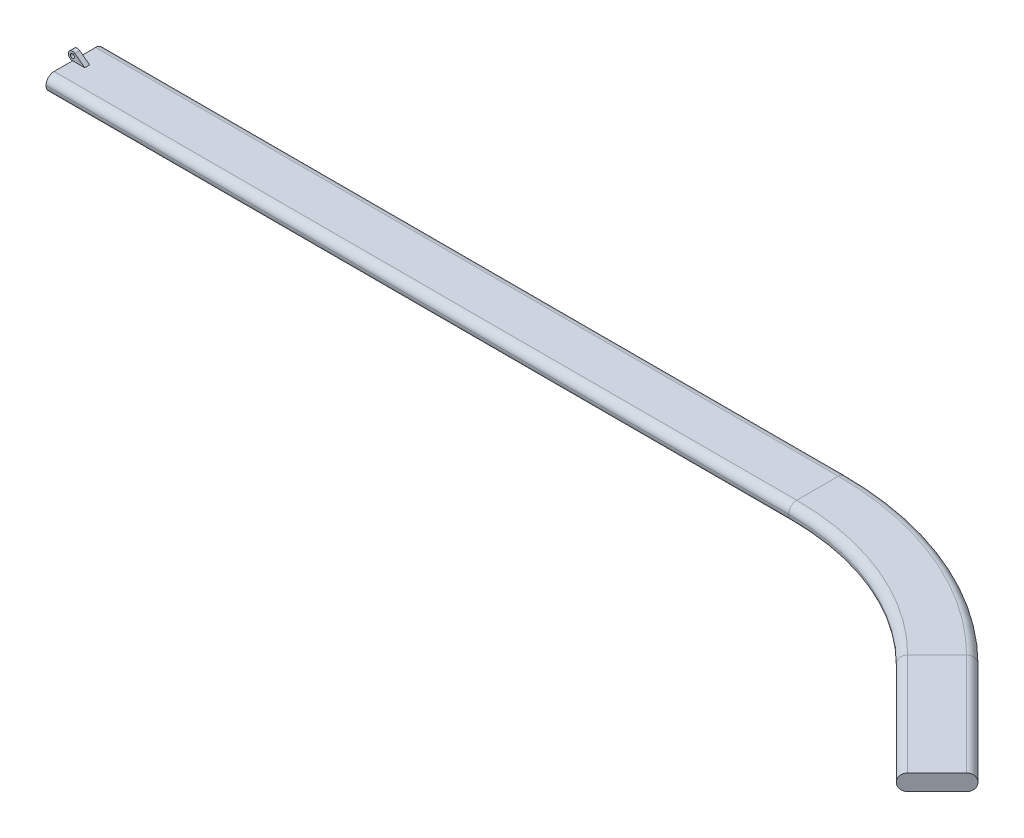
ISO-10303-21;
HEADER;
FILE_DESCRIPTION(('STEP AP214'),'2;1');
FILE_NAME('part.step','',(''),(''),'','','');
FILE_SCHEMA(('AUTOMOTIVE_DESIGN { 1 0 10303 214 1 1 1 1 }'));
ENDSEC;
DATA;
#1=APPLICATION_CONTEXT('core data for automotive mechanical design processes');
#2=APPLICATION_PROTOCOL_DEFINITION('international standard','automotive_design',2000,#1);
#3=PRODUCT_CONTEXT('',#1,'mechanical');
#4=PRODUCT('Part','Part','',(#3));
#5=PRODUCT_RELATED_PRODUCT_CATEGORY('part','',(#4));
#6=PRODUCT_DEFINITION_FORMATION('','',#4);
#7=PRODUCT_DEFINITION_CONTEXT('part definition',#1,'design');
#8=PRODUCT_DEFINITION('design','',#6,#7);
#9=PRODUCT_DEFINITION_SHAPE('','',#8);
#10=(LENGTH_UNIT() NAMED_UNIT(*) SI_UNIT(.MILLI.,.METRE.));
#11=(NAMED_UNIT(*) PLANE_ANGLE_UNIT() SI_UNIT($,.RADIAN.));
#12=(NAMED_UNIT(*) SI_UNIT($,.STERADIAN.) SOLID_ANGLE_UNIT());
#13=UNCERTAINTY_MEASURE_WITH_UNIT(LENGTH_MEASURE(1.E-05),#10,'distance_accuracy_value','');
#14=(GEOMETRIC_REPRESENTATION_CONTEXT(3) GLOBAL_UNCERTAINTY_ASSIGNED_CONTEXT((#13)) GLOBAL_UNIT_ASSIGNED_CONTEXT((#10,
#11,#12)) REPRESENTATION_CONTEXT('',''));
#15=CARTESIAN_POINT('',(0.,0.,0.));
#16=DIRECTION('',(0.,0.,1.));
#17=DIRECTION('',(1.,0.,0.));
#18=AXIS2_PLACEMENT_3D('',#15,#16,#17);
#19=CARTESIAN_POINT('',(0.302042669776638,1.90345981683758,-0.3));
#20=DIRECTION('',(0.604085339553166,0.796919633675151,0.));
#21=DIRECTION('',(-0.796919633675151,0.604085339553166,0.));
#22=AXIS2_PLACEMENT_3D('',#19,#20,#21);
#23=PLANE('',#22);
#24=DIRECTION('',(-0.796919633675151,0.604085339553166,0.));
#25=VECTOR('',#24,1.);
#26=CARTESIAN_POINT('',(0.302042669776638,1.90345981683758,0.3));
#27=LINE('',#26,#25);
#28=CARTESIAN_POINT('',(1.48730611059389,1.005,0.3));
#29=VERTEX_POINT('',#28);
#30=CARTESIAN_POINT('',(0.302042669776638,1.90345981683758,0.3));
#31=VERTEX_POINT('',#30);
#32=EDGE_CURVE('E100',#29,#31,#27,.T.);
#33=ORIENTED_EDGE('',*,*,#32,.F.);
#34=DIRECTION('',(0.,0.,1.));
#35=VECTOR('',#34,1.);
#36=CARTESIAN_POINT('',(1.48730611059389,1.005,-0.3));
#37=LINE('',#36,#35);
#38=CARTESIAN_POINT('',(1.48730611059389,1.005,-0.3));
#39=VERTEX_POINT('',#38);
#40=EDGE_CURVE('E12',#39,#29,#37,.T.);
#41=ORIENTED_EDGE('',*,*,#40,.F.);
#42=DIRECTION('',(-0.796919633675151,0.604085339553166,0.));
#43=VECTOR('',#42,1.);
#44=CARTESIAN_POINT('',(0.302042669776638,1.90345981683758,-0.3));
#45=LINE('',#44,#43);
#46=CARTESIAN_POINT('',(0.302042669776638,1.90345981683758,-0.3));
#47=VERTEX_POINT('',#46);
#48=EDGE_CURVE('E89',#39,#47,#45,.T.);
#49=ORIENTED_EDGE('',*,*,#48,.T.);
#50=DIRECTION('',(0.,0.,1.));
#51=VECTOR('',#50,1.);
#52=CARTESIAN_POINT('',(0.302042669776638,1.90345981683758,-0.3));
#53=LINE('',#52,#51);
#54=EDGE_CURVE('E48',#47,#31,#53,.T.);
#55=ORIENTED_EDGE('',*,*,#54,.T.);
#56=EDGE_LOOP('',(#33,#41,#49,#55));
#57=FACE_BOUND('',#56,.T.);
#58=ADVANCED_FACE('F45',(#57),#23,.T.);
#59=CARTESIAN_POINT('',(1.48730611059389,1.005,-0.3));
#60=DIRECTION('',(0.,-1.,0.));
#61=DIRECTION('',(0.,0.,-1.));
#62=AXIS2_PLACEMENT_3D('',#59,#60,#61);
#63=PLANE('',#62);
#64=DIRECTION('',(1.,0.,0.));
#65=VECTOR('',#64,1.);
#66=CARTESIAN_POINT('',(1.48730611059389,1.005,0.3));
#67=LINE('',#66,#65);
#68=CARTESIAN_POINT('',(0.,1.005,0.3));
#69=VERTEX_POINT('',#68);
#70=EDGE_CURVE('E91',#69,#29,#67,.T.);
#71=ORIENTED_EDGE('',*,*,#70,.F.);
#72=DIRECTION('',(0.,0.,1.));
#73=VECTOR('',#72,1.);
#74=CARTESIAN_POINT('',(0.,1.005,-0.3));
#75=LINE('',#74,#73);
#76=CARTESIAN_POINT('',(0.,1.005,-0.3));
#77=VERTEX_POINT('',#76);
#78=EDGE_CURVE('E54',#77,#69,#75,.T.);
#79=ORIENTED_EDGE('',*,*,#78,.F.);
#80=DIRECTION('',(1.,0.,0.));
#81=VECTOR('',#80,1.);
#82=CARTESIAN_POINT('',(1.48730611059389,1.005,-0.3));
#83=LINE('',#82,#81);
#84=EDGE_CURVE('E86',#77,#39,#83,.T.);
#85=ORIENTED_EDGE('',*,*,#84,.T.);
#86=ORIENTED_EDGE('',*,*,#40,.T.);
#87=EDGE_LOOP('',(#71,#79,#85,#86));
#88=FACE_BOUND('',#87,.T.);
#89=ADVANCED_FACE('F105',(#88),#63,.T.);
#90=CARTESIAN_POINT('',(0.,1.505,-0.3));
#91=DIRECTION('',(0.,0.,1.));
#92=DIRECTION('',(1.,0.,0.));
#93=AXIS2_PLACEMENT_3D('',#90,#91,#92);
#94=CYLINDRICAL_SURFACE('',#93,0.5);
#95=CARTESIAN_POINT('',(0.,1.505,0.3));
#96=DIRECTION('',(0.,0.,1.));
#97=DIRECTION('',(1.,0.,0.));
#98=AXIS2_PLACEMENT_3D('',#95,#96,#97);
#99=CIRCLE('',#98,0.5);
#100=EDGE_CURVE('E84',#31,#69,#99,.T.);
#101=ORIENTED_EDGE('',*,*,#100,.F.);
#102=ORIENTED_EDGE('',*,*,#54,.F.);
#103=CARTESIAN_POINT('',(0.,1.505,-0.3));
#104=DIRECTION('',(0.,0.,1.));
#105=DIRECTION('',(1.,0.,0.));
#106=AXIS2_PLACEMENT_3D('',#103,#104,#105);
#107=CIRCLE('',#106,0.5);
#108=EDGE_CURVE('E82',#47,#77,#107,.T.);
#109=ORIENTED_EDGE('',*,*,#108,.T.);
#110=ORIENTED_EDGE('',*,*,#78,.T.);
#111=EDGE_LOOP('',(#101,#102,#109,#110));
#112=FACE_BOUND('',#111,.T.);
#113=ADVANCED_FACE('F81',(#112),#94,.T.);
#114=CARTESIAN_POINT('',(0.,1.505,-0.3));
#115=DIRECTION('',(0.,0.,1.));
#116=DIRECTION('',(1.,0.,0.));
#117=AXIS2_PLACEMENT_3D('',#114,#115,#116);
#118=PLANE('',#117);
#119=CARTESIAN_POINT('',(0.,1.505,-0.3));
#120=DIRECTION('',(0.,0.,1.));
#121=DIRECTION('',(1.,0.,0.));
#122=AXIS2_PLACEMENT_3D('',#119,#120,#121);
#123=CIRCLE('',#122,0.25);
#124=CARTESIAN_POINT('',(0.250000000000055,1.505,-0.3));
#125=VERTEX_POINT('',#124);
#126=EDGE_CURVE('E102',#125,#125,#123,.T.);
#127=ORIENTED_EDGE('',*,*,#126,.T.);
#128=EDGE_LOOP('',(#127));
#129=FACE_BOUND('',#128,.T.);
#130=ORIENTED_EDGE('',*,*,#48,.F.);
#131=ORIENTED_EDGE('',*,*,#84,.F.);
#132=ORIENTED_EDGE('',*,*,#108,.F.);
#133=EDGE_LOOP('',(#130,#131,#132));
#134=FACE_BOUND('',#133,.T.);
#135=ADVANCED_FACE('F88',(#129,#134),#118,.F.);
#136=CARTESIAN_POINT('',(0.,1.505,0.3));
#137=DIRECTION('',(0.,0.,1.));
#138=DIRECTION('',(1.,0.,0.));
#139=AXIS2_PLACEMENT_3D('',#136,#137,#138);
#140=PLANE('',#139);
#141=CARTESIAN_POINT('',(0.,1.505,0.3));
#142=DIRECTION('',(0.,0.,1.));
#143=DIRECTION('',(1.,0.,0.));
#144=AXIS2_PLACEMENT_3D('',#141,#142,#143);
#145=CIRCLE('',#144,0.25);
#146=CARTESIAN_POINT('',(0.250000000000055,1.505,0.3));
#147=VERTEX_POINT('',#146);
#148=EDGE_CURVE('E96',#147,#147,#145,.T.);
#149=ORIENTED_EDGE('',*,*,#148,.F.);
#150=EDGE_LOOP('',(#149));
#151=FACE_BOUND('',#150,.T.);
#152=ORIENTED_EDGE('',*,*,#32,.T.);
#153=ORIENTED_EDGE('',*,*,#100,.T.);
#154=ORIENTED_EDGE('',*,*,#70,.T.);
#155=EDGE_LOOP('',(#152,#153,#154));
#156=FACE_BOUND('',#155,.T.);
#157=ADVANCED_FACE('F104',(#151,#156),#140,.T.);
#158=CARTESIAN_POINT('',(0.,1.505,-0.3));
#159=DIRECTION('',(0.,0.,1.));
#160=DIRECTION('',(1.,0.,0.));
#161=AXIS2_PLACEMENT_3D('',#158,#159,#160);
#162=CYLINDRICAL_SURFACE('',#161,0.25);
#163=ORIENTED_EDGE('',*,*,#126,.F.);
#164=EDGE_LOOP('',(#163));
#165=FACE_BOUND('',#164,.T.);
#166=ORIENTED_EDGE('',*,*,#148,.T.);
#167=EDGE_LOOP('',(#166));
#168=FACE_BOUND('',#167,.T.);
#169=ADVANCED_FACE('F115',(#165,#168),#162,.F.);
#170=CLOSED_SHELL('',(#58,#89,#113,#135,#157,#169));
#171=MANIFOLD_SOLID_BREP('B2',#170);
#172=CARTESIAN_POINT('',(0.,0.,0.));
#173=DIRECTION('',(1.,0.,0.));
#174=DIRECTION('',(0.,0.,-1.));
#175=AXIS2_PLACEMENT_3D('',#172,#173,#174);
#176=PLANE('',#175);
#177=DIRECTION('',(0.,0.,-1.));
#178=VECTOR('',#177,1.);
#179=CARTESIAN_POINT('',(0.,-0.985,-3.5));
#180=LINE('',#179,#178);
#181=CARTESIAN_POINT('',(0.,-0.984999999999999,2.52));
#182=VERTEX_POINT('',#181);
#183=CARTESIAN_POINT('',(0.,-0.985,-2.52));
#184=VERTEX_POINT('',#183);
#185=EDGE_CURVE('E411',#182,#184,#180,.T.);
#186=ORIENTED_EDGE('',*,*,#185,.F.);
#187=CARTESIAN_POINT('',(0.,-0.0049999999999998,2.52));
#188=DIRECTION('',(1.,0.,0.));
#189=DIRECTION('',(0.,0.,-1.));
#190=AXIS2_PLACEMENT_3D('',#187,#188,#189);
#191=CIRCLE('',#190,0.98);
#192=CARTESIAN_POINT('',(0.,-0.0049999999999998,3.5));
#193=VERTEX_POINT('',#192);
#194=EDGE_CURVE('E359',#182,#193,#191,.F.);
#195=ORIENTED_EDGE('',*,*,#194,.T.);
#196=DIRECTION('',(0.,-1.,0.));
#197=VECTOR('',#196,1.);
#198=CARTESIAN_POINT('',(0.,-0.984999999999999,3.5));
#199=LINE('',#198,#197);
#200=CARTESIAN_POINT('',(0.,0.00500000000000045,3.5));
#201=VERTEX_POINT('',#200);
#202=EDGE_CURVE('E408',#201,#193,#199,.T.);
#203=ORIENTED_EDGE('',*,*,#202,.F.);
#204=CARTESIAN_POINT('',(0.,0.00500000000000045,2.52));
#205=DIRECTION('',(1.,0.,0.));
#206=DIRECTION('',(0.,0.,-1.));
#207=AXIS2_PLACEMENT_3D('',#204,#205,#206);
#208=CIRCLE('',#207,0.98);
#209=CARTESIAN_POINT('',(0.,0.985,2.52));
#210=VERTEX_POINT('',#209);
#211=EDGE_CURVE('E357',#201,#210,#208,.F.);
#212=ORIENTED_EDGE('',*,*,#211,.T.);
#213=DIRECTION('',(0.,0.,1.));
#214=VECTOR('',#213,1.);
#215=CARTESIAN_POINT('',(0.,0.985,-3.5));
#216=LINE('',#215,#214);
#217=CARTESIAN_POINT('',(0.,0.985,-2.52));
#218=VERTEX_POINT('',#217);
#219=EDGE_CURVE('E401',#218,#210,#216,.T.);
#220=ORIENTED_EDGE('',*,*,#219,.F.);
#221=CARTESIAN_POINT('',(0.,0.00500000000000023,-2.52));
#222=DIRECTION('',(1.,0.,0.));
#223=DIRECTION('',(0.,0.,-1.));
#224=AXIS2_PLACEMENT_3D('',#221,#222,#223);
#225=CIRCLE('',#224,0.98);
#226=CARTESIAN_POINT('',(0.,0.00500000000000023,-3.5));
#227=VERTEX_POINT('',#226);
#228=EDGE_CURVE('E181',#218,#227,#225,.F.);
#229=ORIENTED_EDGE('',*,*,#228,.T.);
#230=DIRECTION('',(0.,1.,0.));
#231=VECTOR('',#230,1.);
#232=CARTESIAN_POINT('',(0.,-0.985,-3.5));
#233=LINE('',#232,#231);
#234=CARTESIAN_POINT('',(0.,-0.00500000000000001,-3.5));
#235=VERTEX_POINT('',#234);
#236=EDGE_CURVE('E373',#235,#227,#233,.T.);
#237=ORIENTED_EDGE('',*,*,#236,.F.);
#238=CARTESIAN_POINT('',(0.,-0.00499999999999995,-2.52));
#239=DIRECTION('',(1.,0.,0.));
#240=DIRECTION('',(0.,0.,-1.));
#241=AXIS2_PLACEMENT_3D('',#238,#239,#240);
#242=CIRCLE('',#241,0.98);
#243=EDGE_CURVE('E355',#235,#184,#242,.F.);
#244=ORIENTED_EDGE('',*,*,#243,.T.);
#245=EDGE_LOOP('',(#186,#195,#203,#212,#220,#229,#237,#244));
#246=FACE_BOUND('',#245,.T.);
#247=ADVANCED_FACE('F164',(#246),#176,.F.);
#248=CARTESIAN_POINT('',(127.130929640481,0.,22.6334549574227));
#249=DIRECTION('',(0.707106781186547,0.,0.707106781186548));
#250=DIRECTION('',(0.707106781186548,0.,-0.707106781186547));
#251=AXIS2_PLACEMENT_3D('',#248,#249,#250);
#252=PLANE('',#251);
#253=DIRECTION('',(0.,-1.,0.));
#254=VECTOR('',#253,1.);
#255=CARTESIAN_POINT('',(124.656055906328,-0.984999999999999,25.1083286915756));
#256=LINE('',#255,#254);
#257=CARTESIAN_POINT('',(124.656055906328,0.00500000000000023,25.1083286915756));
#258=VERTEX_POINT('',#257);
#259=CARTESIAN_POINT('',(124.656055906328,-0.00499999999999936,25.1083286915756));
#260=VERTEX_POINT('',#259);
#261=EDGE_CURVE('E282',#258,#260,#256,.T.);
#262=ORIENTED_EDGE('',*,*,#261,.T.);
#263=CARTESIAN_POINT('',(125.349020551891,-0.00499999999999936,24.4153640460128));
#264=DIRECTION('',(0.707106781186547,0.,0.707106781186548));
#265=DIRECTION('',(0.707106781186548,0.,-0.707106781186547));
#266=AXIS2_PLACEMENT_3D('',#263,#264,#265);
#267=CIRCLE('',#266,0.98);
#268=CARTESIAN_POINT('',(125.349020551891,-0.984999999999999,24.4153640460128));
#269=VERTEX_POINT('',#268);
#270=EDGE_CURVE('E289',#260,#269,#267,.T.);
#271=ORIENTED_EDGE('',*,*,#270,.T.);
#272=DIRECTION('',(0.707106781186548,0.,-0.707106781186547));
#273=VECTOR('',#272,1.);
#274=CARTESIAN_POINT('',(129.605803374634,-0.985,20.1585812232697));
#275=LINE('',#274,#273);
#276=CARTESIAN_POINT('',(128.912838729071,-0.985,20.8515458688326));
#277=VERTEX_POINT('',#276);
#278=EDGE_CURVE('E300',#269,#277,#275,.T.);
#279=ORIENTED_EDGE('',*,*,#278,.T.);
#280=CARTESIAN_POINT('',(128.912838729071,-0.00499999999999974,20.8515458688326));
#281=DIRECTION('',(0.707106781186547,0.,0.707106781186548));
#282=DIRECTION('',(0.707106781186548,0.,-0.707106781186547));
#283=AXIS2_PLACEMENT_3D('',#280,#281,#282);
#284=CIRCLE('',#283,0.98);
#285=CARTESIAN_POINT('',(129.605803374634,-0.0049999999999998,20.1585812232697));
#286=VERTEX_POINT('',#285);
#287=EDGE_CURVE('E290',#277,#286,#284,.T.);
#288=ORIENTED_EDGE('',*,*,#287,.T.);
#289=DIRECTION('',(0.,1.,0.));
#290=VECTOR('',#289,1.);
#291=CARTESIAN_POINT('',(129.605803374634,-0.985,20.1585812232697));
#292=LINE('',#291,#290);
#293=CARTESIAN_POINT('',(129.605803374634,0.00500000000000023,20.1585812232697));
#294=VERTEX_POINT('',#293);
#295=EDGE_CURVE('E416',#286,#294,#292,.T.);
#296=ORIENTED_EDGE('',*,*,#295,.T.);
#297=CARTESIAN_POINT('',(128.912838729071,0.00500000000000023,20.8515458688326));
#298=DIRECTION('',(0.707106781186547,0.,0.707106781186548));
#299=DIRECTION('',(0.707106781186548,0.,-0.707106781186547));
#300=AXIS2_PLACEMENT_3D('',#297,#298,#299);
#301=CIRCLE('',#300,0.98);
#302=CARTESIAN_POINT('',(128.912838729071,0.985,20.8515458688326));
#303=VERTEX_POINT('',#302);
#304=EDGE_CURVE('E307',#294,#303,#301,.T.);
#305=ORIENTED_EDGE('',*,*,#304,.T.);
#306=DIRECTION('',(-0.707106781186548,0.,0.707106781186547));
#307=VECTOR('',#306,1.);
#308=CARTESIAN_POINT('',(129.605803374634,0.985,20.1585812232697));
#309=LINE('',#308,#307);
#310=CARTESIAN_POINT('',(125.349020551891,0.985,24.4153640460128));
#311=VERTEX_POINT('',#310);
#312=EDGE_CURVE('E284',#303,#311,#309,.T.);
#313=ORIENTED_EDGE('',*,*,#312,.T.);
#314=CARTESIAN_POINT('',(125.349020551891,0.00500000000000023,24.4153640460128));
#315=DIRECTION('',(0.707106781186547,0.,0.707106781186548));
#316=DIRECTION('',(0.707106781186548,0.,-0.707106781186547));
#317=AXIS2_PLACEMENT_3D('',#314,#315,#316);
#318=CIRCLE('',#317,0.98);
#319=EDGE_CURVE('E279',#311,#258,#318,.T.);
#320=ORIENTED_EDGE('',*,*,#319,.T.);
#321=EDGE_LOOP('',(#262,#271,#279,#288,#296,#305,#313,#320));
#322=FACE_BOUND('',#321,.T.);
#323=ADVANCED_FACE('F281',(#322),#252,.T.);
#324=CARTESIAN_POINT('',(0.,-0.985,-3.5));
#325=DIRECTION('',(0.,0.,-1.));
#326=DIRECTION('',(-1.,0.,0.));
#327=AXIS2_PLACEMENT_3D('',#324,#325,#326);
#328=PLANE('',#327);
#329=DIRECTION('',(0.,1.,0.));
#330=VECTOR('',#329,1.);
#331=CARTESIAN_POINT('',(90.,-0.985,-3.5));
#332=LINE('',#331,#330);
#333=CARTESIAN_POINT('',(90.,-0.00500000000000001,-3.5));
#334=VERTEX_POINT('',#333);
#335=CARTESIAN_POINT('',(90.,0.00500000000000023,-3.5));
#336=VERTEX_POINT('',#335);
#337=EDGE_CURVE('E420',#334,#336,#332,.T.);
#338=ORIENTED_EDGE('',*,*,#337,.F.);
#339=DIRECTION('',(1.,0.,0.));
#340=VECTOR('',#339,1.);
#341=CARTESIAN_POINT('',(0.,-0.00500000000000001,-3.5));
#342=LINE('',#341,#340);
#343=EDGE_CURVE('E43',#334,#235,#342,.F.);
#344=ORIENTED_EDGE('',*,*,#343,.T.);
#345=ORIENTED_EDGE('',*,*,#236,.T.);
#346=DIRECTION('',(1.,0.,0.));
#347=VECTOR('',#346,1.);
#348=CARTESIAN_POINT('',(0.,0.00500000000000023,-3.5));
#349=LINE('',#348,#347);
#350=EDGE_CURVE('E173',#227,#336,#349,.T.);
#351=ORIENTED_EDGE('',*,*,#350,.T.);
#352=EDGE_LOOP('',(#338,#344,#345,#351));
#353=FACE_BOUND('',#352,.T.);
#354=ADVANCED_FACE('F457',(#353),#328,.T.);
#355=CARTESIAN_POINT('',(0.,0.985,-3.5));
#356=DIRECTION('',(0.,1.,0.));
#357=DIRECTION('',(0.,0.,1.));
#358=AXIS2_PLACEMENT_3D('',#355,#356,#357);
#359=PLANE('',#358);
#360=ORIENTED_EDGE('',*,*,#219,.T.);
#361=DIRECTION('',(1.,0.,0.));
#362=VECTOR('',#361,1.);
#363=CARTESIAN_POINT('',(0.,0.985,2.52));
#364=LINE('',#363,#362);
#365=CARTESIAN_POINT('',(90.,0.985,2.52));
#366=VERTEX_POINT('',#365);
#367=EDGE_CURVE('E363',#210,#366,#364,.T.);
#368=ORIENTED_EDGE('',*,*,#367,.T.);
#369=DIRECTION('',(0.,0.,1.));
#370=VECTOR('',#369,1.);
#371=CARTESIAN_POINT('',(90.,0.985,-3.5));
#372=LINE('',#371,#370);
#373=CARTESIAN_POINT('',(90.,0.985,-2.52));
#374=VERTEX_POINT('',#373);
#375=EDGE_CURVE('E404',#374,#366,#372,.T.);
#376=ORIENTED_EDGE('',*,*,#375,.F.);
#377=DIRECTION('',(1.,0.,0.));
#378=VECTOR('',#377,1.);
#379=CARTESIAN_POINT('',(0.,0.985,-2.52));
#380=LINE('',#379,#378);
#381=EDGE_CURVE('E361',#374,#218,#380,.F.);
#382=ORIENTED_EDGE('',*,*,#381,.T.);
#383=EDGE_LOOP('',(#360,#368,#376,#382));
#384=FACE_BOUND('',#383,.T.);
#385=ADVANCED_FACE('F400',(#384),#359,.T.);
#386=CARTESIAN_POINT('',(0.,-0.984999999999999,3.5));
#387=DIRECTION('',(0.,0.,1.));
#388=DIRECTION('',(1.,0.,0.));
#389=AXIS2_PLACEMENT_3D('',#386,#387,#388);
#390=PLANE('',#389);
#391=ORIENTED_EDGE('',*,*,#202,.T.);
#392=DIRECTION('',(1.,0.,0.));
#393=VECTOR('',#392,1.);
#394=CARTESIAN_POINT('',(0.,-0.0049999999999998,3.5));
#395=LINE('',#394,#393);
#396=CARTESIAN_POINT('',(90.,-0.0049999999999998,3.5));
#397=VERTEX_POINT('',#396);
#398=EDGE_CURVE('E348',#193,#397,#395,.T.);
#399=ORIENTED_EDGE('',*,*,#398,.T.);
#400=DIRECTION('',(0.,-1.,0.));
#401=VECTOR('',#400,1.);
#402=CARTESIAN_POINT('',(90.,-0.984999999999999,3.5));
#403=LINE('',#402,#401);
#404=CARTESIAN_POINT('',(90.,0.00500000000000045,3.5));
#405=VERTEX_POINT('',#404);
#406=EDGE_CURVE('E419',#405,#397,#403,.T.);
#407=ORIENTED_EDGE('',*,*,#406,.F.);
#408=DIRECTION('',(1.,0.,0.));
#409=VECTOR('',#408,1.);
#410=CARTESIAN_POINT('',(0.,0.00500000000000045,3.5));
#411=LINE('',#410,#409);
#412=EDGE_CURVE('E346',#405,#201,#411,.F.);
#413=ORIENTED_EDGE('',*,*,#412,.T.);
#414=EDGE_LOOP('',(#391,#399,#407,#413));
#415=FACE_BOUND('',#414,.T.);
#416=ADVANCED_FACE('F483',(#415),#390,.T.);
#417=CARTESIAN_POINT('',(0.,-0.985,-3.5));
#418=DIRECTION('',(0.,-1.,0.));
#419=DIRECTION('',(0.,0.,-1.));
#420=AXIS2_PLACEMENT_3D('',#417,#418,#419);
#421=PLANE('',#420);
#422=DIRECTION('',(0.,0.,-1.));
#423=VECTOR('',#422,1.);
#424=CARTESIAN_POINT('',(90.,-0.985,-3.5));
#425=LINE('',#424,#423);
#426=CARTESIAN_POINT('',(90.,-0.984999999999999,2.52));
#427=VERTEX_POINT('',#426);
#428=CARTESIAN_POINT('',(90.,-0.985,-2.52));
#429=VERTEX_POINT('',#428);
#430=EDGE_CURVE('E429',#427,#429,#425,.T.);
#431=ORIENTED_EDGE('',*,*,#430,.F.);
#432=DIRECTION('',(1.,0.,0.));
#433=VECTOR('',#432,1.);
#434=CARTESIAN_POINT('',(0.,-0.984999999999999,2.52));
#435=LINE('',#434,#433);
#436=EDGE_CURVE('E352',#427,#182,#435,.F.);
#437=ORIENTED_EDGE('',*,*,#436,.T.);
#438=ORIENTED_EDGE('',*,*,#185,.T.);
#439=DIRECTION('',(1.,0.,0.));
#440=VECTOR('',#439,1.);
#441=CARTESIAN_POINT('',(0.,-0.985,-2.52));
#442=LINE('',#441,#440);
#443=EDGE_CURVE('E350',#184,#429,#442,.T.);
#444=ORIENTED_EDGE('',*,*,#443,.T.);
#445=EDGE_LOOP('',(#431,#437,#438,#444));
#446=FACE_BOUND('',#445,.T.);
#447=ADVANCED_FACE('F466',(#446),#421,.T.);
#448=CARTESIAN_POINT('',(90.,0.,35.));
#449=DIRECTION('',(0.,-1.,0.));
#450=DIRECTION('',(0.,0.,-1.));
#451=AXIS2_PLACEMENT_3D('',#448,#449,#450);
#452=CYLINDRICAL_SURFACE('',#451,38.5);
#453=DIRECTION('',(0.,1.,0.));
#454=VECTOR('',#453,1.);
#455=CARTESIAN_POINT('',(117.223611075682,-0.985,7.77638892431797));
#456=LINE('',#455,#454);
#457=CARTESIAN_POINT('',(117.223611075682,-0.00499999999999958,7.77638892431797));
#458=VERTEX_POINT('',#457);
#459=CARTESIAN_POINT('',(117.223611075682,0.00500000000000023,7.77638892431797));
#460=VERTEX_POINT('',#459);
#461=EDGE_CURVE('E425',#458,#460,#456,.T.);
#462=ORIENTED_EDGE('',*,*,#461,.F.);
#463=CARTESIAN_POINT('',(90.,-0.00499999999999958,35.));
#464=DIRECTION('',(0.,-1.,0.));
#465=DIRECTION('',(0.,0.,-1.));
#466=AXIS2_PLACEMENT_3D('',#463,#464,#465);
#467=CIRCLE('',#466,38.5);
#468=EDGE_CURVE('E344',#458,#334,#467,.F.);
#469=ORIENTED_EDGE('',*,*,#468,.T.);
#470=ORIENTED_EDGE('',*,*,#337,.T.);
#471=CARTESIAN_POINT('',(90.,0.00500000000000023,35.));
#472=DIRECTION('',(0.,1.,0.));
#473=DIRECTION('',(0.,0.,1.));
#474=AXIS2_PLACEMENT_3D('',#471,#472,#473);
#475=CIRCLE('',#474,38.5);
#476=EDGE_CURVE('E342',#336,#460,#475,.F.);
#477=ORIENTED_EDGE('',*,*,#476,.T.);
#478=EDGE_LOOP('',(#462,#469,#470,#477));
#479=FACE_BOUND('',#478,.T.);
#480=ADVANCED_FACE('F456',(#479),#452,.T.);
#481=CARTESIAN_POINT('',(90.,0.985,-3.5));
#482=DIRECTION('',(0.,1.,0.));
#483=DIRECTION('',(0.,0.,1.));
#484=AXIS2_PLACEMENT_3D('',#481,#482,#483);
#485=PLANE('',#484);
#486=ORIENTED_EDGE('',*,*,#375,.T.);
#487=CARTESIAN_POINT('',(90.,0.985,35.));
#488=DIRECTION('',(0.,1.,0.));
#489=DIRECTION('',(0.,0.,1.));
#490=AXIS2_PLACEMENT_3D('',#487,#488,#489);
#491=CIRCLE('',#490,32.48);
#492=CARTESIAN_POINT('',(112.966828252939,0.985,12.033171747061));
#493=VERTEX_POINT('',#492);
#494=EDGE_CURVE('E335',#366,#493,#491,.F.);
#495=ORIENTED_EDGE('',*,*,#494,.T.);
#496=DIRECTION('',(-0.707106781186549,0.,0.707106781186546));
#497=VECTOR('',#496,1.);
#498=CARTESIAN_POINT('',(117.223611075682,0.985,7.77638892431797));
#499=LINE('',#498,#497);
#500=CARTESIAN_POINT('',(116.530646430119,0.985,8.46935356988078));
#501=VERTEX_POINT('',#500);
#502=EDGE_CURVE('E421',#501,#493,#499,.T.);
#503=ORIENTED_EDGE('',*,*,#502,.F.);
#504=CARTESIAN_POINT('',(90.,0.985,35.));
#505=DIRECTION('',(0.,1.,0.));
#506=DIRECTION('',(0.,0.,1.));
#507=AXIS2_PLACEMENT_3D('',#504,#505,#506);
#508=CIRCLE('',#507,37.52);
#509=EDGE_CURVE('E333',#501,#374,#508,.T.);
#510=ORIENTED_EDGE('',*,*,#509,.T.);
#511=EDGE_LOOP('',(#486,#495,#503,#510));
#512=FACE_BOUND('',#511,.T.);
#513=ADVANCED_FACE('F492',(#512),#485,.T.);
#514=CARTESIAN_POINT('',(90.,0.,35.));
#515=DIRECTION('',(0.,-1.,0.));
#516=DIRECTION('',(0.,0.,-1.));
#517=AXIS2_PLACEMENT_3D('',#514,#515,#516);
#518=CYLINDRICAL_SURFACE('',#517,31.5);
#519=ORIENTED_EDGE('',*,*,#406,.T.);
#520=CARTESIAN_POINT('',(90.,-0.00499999999999958,35.));
#521=DIRECTION('',(0.,-1.,0.));
#522=DIRECTION('',(0.,0.,-1.));
#523=AXIS2_PLACEMENT_3D('',#520,#521,#522);
#524=CIRCLE('',#523,31.5);
#525=CARTESIAN_POINT('',(112.273863607376,-0.00499999999999958,12.7261363926238));
#526=VERTEX_POINT('',#525);
#527=EDGE_CURVE('E323',#397,#526,#524,.T.);
#528=ORIENTED_EDGE('',*,*,#527,.T.);
#529=DIRECTION('',(0.,-1.,0.));
#530=VECTOR('',#529,1.);
#531=CARTESIAN_POINT('',(112.273863607376,-0.984999999999999,12.7261363926238));
#532=LINE('',#531,#530);
#533=CARTESIAN_POINT('',(112.273863607376,0.00500000000000023,12.7261363926238));
#534=VERTEX_POINT('',#533);
#535=EDGE_CURVE('E424',#534,#526,#532,.T.);
#536=ORIENTED_EDGE('',*,*,#535,.F.);
#537=CARTESIAN_POINT('',(90.,0.00500000000000023,35.));
#538=DIRECTION('',(0.,1.,0.));
#539=DIRECTION('',(0.,0.,1.));
#540=AXIS2_PLACEMENT_3D('',#537,#538,#539);
#541=CIRCLE('',#540,31.5);
#542=EDGE_CURVE('E321',#534,#405,#541,.T.);
#543=ORIENTED_EDGE('',*,*,#542,.T.);
#544=EDGE_LOOP('',(#519,#528,#536,#543));
#545=FACE_BOUND('',#544,.T.);
#546=ADVANCED_FACE('F478',(#545),#518,.F.);
#547=CARTESIAN_POINT('',(90.,-0.985,-3.5));
#548=DIRECTION('',(0.,-1.,0.));
#549=DIRECTION('',(0.,0.,-1.));
#550=AXIS2_PLACEMENT_3D('',#547,#548,#549);
#551=PLANE('',#550);
#552=DIRECTION('',(0.707106781186549,0.,-0.707106781186546));
#553=VECTOR('',#552,1.);
#554=CARTESIAN_POINT('',(117.223611075682,-0.985,7.77638892431797));
#555=LINE('',#554,#553);
#556=CARTESIAN_POINT('',(112.966828252939,-0.984999999999999,12.033171747061));
#557=VERTEX_POINT('',#556);
#558=CARTESIAN_POINT('',(116.530646430119,-0.985,8.46935356988078));
#559=VERTEX_POINT('',#558);
#560=EDGE_CURVE('E430',#557,#559,#555,.T.);
#561=ORIENTED_EDGE('',*,*,#560,.F.);
#562=CARTESIAN_POINT('',(90.,-0.985,35.));
#563=DIRECTION('',(0.,-1.,0.));
#564=DIRECTION('',(0.,0.,-1.));
#565=AXIS2_PLACEMENT_3D('',#562,#563,#564);
#566=CIRCLE('',#565,32.48);
#567=EDGE_CURVE('E327',#557,#427,#566,.F.);
#568=ORIENTED_EDGE('',*,*,#567,.T.);
#569=ORIENTED_EDGE('',*,*,#430,.T.);
#570=CARTESIAN_POINT('',(90.,-0.985,35.));
#571=DIRECTION('',(0.,-1.,0.));
#572=DIRECTION('',(0.,0.,-1.));
#573=AXIS2_PLACEMENT_3D('',#570,#571,#572);
#574=CIRCLE('',#573,37.52);
#575=EDGE_CURVE('E325',#429,#559,#574,.T.);
#576=ORIENTED_EDGE('',*,*,#575,.T.);
#577=EDGE_LOOP('',(#561,#568,#569,#576));
#578=FACE_BOUND('',#577,.T.);
#579=ADVANCED_FACE('F514',(#578),#551,.T.);
#580=CARTESIAN_POINT('',(117.223611075682,-0.985,7.77638892431797));
#581=DIRECTION('',(0.707106781186548,0.,-0.707106781186547));
#582=DIRECTION('',(-0.707106781186547,0.,-0.707106781186548));
#583=AXIS2_PLACEMENT_3D('',#580,#581,#582);
#584=PLANE('',#583);
#585=ORIENTED_EDGE('',*,*,#295,.F.);
#586=DIRECTION('',(0.707106781186547,0.,0.707106781186548));
#587=VECTOR('',#586,1.);
#588=CARTESIAN_POINT('',(117.223611075682,-0.0049999999999998,7.77638892431797));
#589=LINE('',#588,#587);
#590=EDGE_CURVE('E340',#286,#458,#589,.F.);
#591=ORIENTED_EDGE('',*,*,#590,.T.);
#592=ORIENTED_EDGE('',*,*,#461,.T.);
#593=DIRECTION('',(0.707106781186547,0.,0.707106781186548));
#594=VECTOR('',#593,1.);
#595=CARTESIAN_POINT('',(117.223611075682,0.00500000000000023,7.77638892431797));
#596=LINE('',#595,#594);
#597=EDGE_CURVE('E337',#460,#294,#596,.T.);
#598=ORIENTED_EDGE('',*,*,#597,.T.);
#599=EDGE_LOOP('',(#585,#591,#592,#598));
#600=FACE_BOUND('',#599,.T.);
#601=ADVANCED_FACE('F443',(#600),#584,.T.);
#602=CARTESIAN_POINT('',(117.223611075682,0.985,7.77638892431797));
#603=DIRECTION('',(0.,1.,0.));
#604=DIRECTION('',(0.,0.,1.));
#605=AXIS2_PLACEMENT_3D('',#602,#603,#604);
#606=PLANE('',#605);
#607=ORIENTED_EDGE('',*,*,#502,.T.);
#608=DIRECTION('',(0.707106781186547,0.,0.707106781186548));
#609=VECTOR('',#608,1.);
#610=CARTESIAN_POINT('',(112.966828252939,0.985,12.033171747061));
#611=LINE('',#610,#609);
#612=EDGE_CURVE('E331',#493,#311,#611,.T.);
#613=ORIENTED_EDGE('',*,*,#612,.T.);
#614=ORIENTED_EDGE('',*,*,#312,.F.);
#615=DIRECTION('',(0.707106781186547,0.,0.707106781186548));
#616=VECTOR('',#615,1.);
#617=CARTESIAN_POINT('',(116.530646430119,0.985,8.46935356988078));
#618=LINE('',#617,#616);
#619=EDGE_CURVE('E329',#303,#501,#618,.F.);
#620=ORIENTED_EDGE('',*,*,#619,.T.);
#621=EDGE_LOOP('',(#607,#613,#614,#620));
#622=FACE_BOUND('',#621,.T.);
#623=ADVANCED_FACE('F494',(#622),#606,.T.);
#624=CARTESIAN_POINT('',(112.273863607376,-0.984999999999999,12.7261363926238));
#625=DIRECTION('',(-0.707106781186548,0.,0.707106781186547));
#626=DIRECTION('',(0.707106781186547,0.,0.707106781186548));
#627=AXIS2_PLACEMENT_3D('',#624,#625,#626);
#628=PLANE('',#627);
#629=ORIENTED_EDGE('',*,*,#535,.T.);
#630=DIRECTION('',(0.707106781186547,0.,0.707106781186548));
#631=VECTOR('',#630,1.);
#632=CARTESIAN_POINT('',(112.273863607376,-0.00499999999999936,12.7261363926238));
#633=LINE('',#632,#631);
#634=EDGE_CURVE('E299',#526,#260,#633,.T.);
#635=ORIENTED_EDGE('',*,*,#634,.T.);
#636=ORIENTED_EDGE('',*,*,#261,.F.);
#637=DIRECTION('',(0.707106781186547,0.,0.707106781186548));
#638=VECTOR('',#637,1.);
#639=CARTESIAN_POINT('',(112.273863607376,0.00500000000000023,12.7261363926238));
#640=LINE('',#639,#638);
#641=EDGE_CURVE('E296',#258,#534,#640,.F.);
#642=ORIENTED_EDGE('',*,*,#641,.T.);
#643=EDGE_LOOP('',(#629,#635,#636,#642));
#644=FACE_BOUND('',#643,.T.);
#645=ADVANCED_FACE('F295',(#644),#628,.T.);
#646=CARTESIAN_POINT('',(117.223611075682,-0.985,7.77638892431797));
#647=DIRECTION('',(0.,-1.,0.));
#648=DIRECTION('',(1.,0.,0.));
#649=AXIS2_PLACEMENT_3D('',#646,#647,#648);
#650=PLANE('',#649);
#651=ORIENTED_EDGE('',*,*,#278,.F.);
#652=DIRECTION('',(0.707106781186547,0.,0.707106781186548));
#653=VECTOR('',#652,1.);
#654=CARTESIAN_POINT('',(112.966828252939,-0.984999999999999,12.033171747061));
#655=LINE('',#654,#653);
#656=EDGE_CURVE('E319',#269,#557,#655,.F.);
#657=ORIENTED_EDGE('',*,*,#656,.T.);
#658=ORIENTED_EDGE('',*,*,#560,.T.);
#659=DIRECTION('',(0.707106781186547,0.,0.707106781186548));
#660=VECTOR('',#659,1.);
#661=CARTESIAN_POINT('',(116.530646430119,-0.985,8.46935356988078));
#662=LINE('',#661,#660);
#663=EDGE_CURVE('E316',#559,#277,#662,.T.);
#664=ORIENTED_EDGE('',*,*,#663,.T.);
#665=EDGE_LOOP('',(#651,#657,#658,#664));
#666=FACE_BOUND('',#665,.T.);
#667=ADVANCED_FACE('F502',(#666),#650,.T.);
#668=CARTESIAN_POINT('',(0.,-0.0049999999999998,2.52));
#669=DIRECTION('',(1.,0.,0.));
#670=DIRECTION('',(0.,0.,-1.));
#671=AXIS2_PLACEMENT_3D('',#668,#669,#670);
#672=CYLINDRICAL_SURFACE('',#671,0.98);
#673=ORIENTED_EDGE('',*,*,#194,.F.);
#674=ORIENTED_EDGE('',*,*,#436,.F.);
#675=CARTESIAN_POINT('',(90.,-0.0049999999999998,2.52));
#676=DIRECTION('',(1.,0.,0.));
#677=DIRECTION('',(0.,0.,-1.));
#678=AXIS2_PLACEMENT_3D('',#675,#676,#677);
#679=CIRCLE('',#678,0.98);
#680=EDGE_CURVE('E369',#397,#427,#679,.T.);
#681=ORIENTED_EDGE('',*,*,#680,.F.);
#682=ORIENTED_EDGE('',*,*,#398,.F.);
#683=EDGE_LOOP('',(#673,#674,#681,#682));
#684=FACE_BOUND('',#683,.T.);
#685=ADVANCED_FACE('F470',(#684),#672,.T.);
#686=CARTESIAN_POINT('',(90.,-0.00499999999999958,35.));
#687=DIRECTION('',(0.,-1.,0.));
#688=DIRECTION('',(0.,0.,-1.));
#689=AXIS2_PLACEMENT_3D('',#686,#687,#688);
#690=TOROIDAL_SURFACE('',#689,32.48,0.98);
#691=ORIENTED_EDGE('',*,*,#680,.T.);
#692=ORIENTED_EDGE('',*,*,#567,.F.);
#693=CARTESIAN_POINT('',(112.966828252939,-0.00499999999999958,12.033171747061));
#694=DIRECTION('',(0.707106781186548,0.,0.707106781186548));
#695=DIRECTION('',(0.707106781186548,0.,-0.707106781186548));
#696=AXIS2_PLACEMENT_3D('',#693,#694,#695);
#697=CIRCLE('',#696,0.98);
#698=EDGE_CURVE('E366',#526,#557,#697,.T.);
#699=ORIENTED_EDGE('',*,*,#698,.F.);
#700=ORIENTED_EDGE('',*,*,#527,.F.);
#701=EDGE_LOOP('',(#691,#692,#699,#700));
#702=FACE_BOUND('',#701,.T.);
#703=ADVANCED_FACE('F475',(#702),#690,.T.);
#704=CARTESIAN_POINT('',(112.966828252939,-0.00499999999999936,12.033171747061));
#705=DIRECTION('',(0.707106781186547,0.,0.707106781186548));
#706=DIRECTION('',(0.707106781186548,0.,-0.707106781186547));
#707=AXIS2_PLACEMENT_3D('',#704,#705,#706);
#708=CYLINDRICAL_SURFACE('',#707,0.98);
#709=ORIENTED_EDGE('',*,*,#698,.T.);
#710=ORIENTED_EDGE('',*,*,#656,.F.);
#711=ORIENTED_EDGE('',*,*,#270,.F.);
#712=ORIENTED_EDGE('',*,*,#634,.F.);
#713=EDGE_LOOP('',(#709,#710,#711,#712));
#714=FACE_BOUND('',#713,.T.);
#715=ADVANCED_FACE('F520',(#714),#708,.T.);
#716=CARTESIAN_POINT('',(0.,0.00500000000000045,2.52));
#717=DIRECTION('',(1.,0.,0.));
#718=DIRECTION('',(0.,0.,-1.));
#719=AXIS2_PLACEMENT_3D('',#716,#717,#718);
#720=CYLINDRICAL_SURFACE('',#719,0.98);
#721=ORIENTED_EDGE('',*,*,#211,.F.);
#722=ORIENTED_EDGE('',*,*,#412,.F.);
#723=CARTESIAN_POINT('',(90.,0.00500000000000023,2.52));
#724=DIRECTION('',(1.,0.,0.));
#725=DIRECTION('',(0.,0.,-1.));
#726=AXIS2_PLACEMENT_3D('',#723,#724,#725);
#727=CIRCLE('',#726,0.98);
#728=EDGE_CURVE('E370',#366,#405,#727,.T.);
#729=ORIENTED_EDGE('',*,*,#728,.F.);
#730=ORIENTED_EDGE('',*,*,#367,.F.);
#731=EDGE_LOOP('',(#721,#722,#729,#730));
#732=FACE_BOUND('',#731,.T.);
#733=ADVANCED_FACE('F486',(#732),#720,.T.);
#734=CARTESIAN_POINT('',(90.,0.00500000000000023,35.));
#735=DIRECTION('',(0.,1.,0.));
#736=DIRECTION('',(0.,0.,1.));
#737=AXIS2_PLACEMENT_3D('',#734,#735,#736);
#738=TOROIDAL_SURFACE('',#737,32.48,0.98);
#739=ORIENTED_EDGE('',*,*,#728,.T.);
#740=ORIENTED_EDGE('',*,*,#542,.F.);
#741=CARTESIAN_POINT('',(112.966828252939,0.00500000000000023,12.033171747061));
#742=DIRECTION('',(0.707106781186547,0.,0.707106781186548));
#743=DIRECTION('',(0.707106781186548,0.,-0.707106781186547));
#744=AXIS2_PLACEMENT_3D('',#741,#742,#743);
#745=CIRCLE('',#744,0.98);
#746=EDGE_CURVE('E305',#493,#534,#745,.T.);
#747=ORIENTED_EDGE('',*,*,#746,.F.);
#748=ORIENTED_EDGE('',*,*,#494,.F.);
#749=EDGE_LOOP('',(#739,#740,#747,#748));
#750=FACE_BOUND('',#749,.T.);
#751=ADVANCED_FACE('F489',(#750),#738,.T.);
#752=CARTESIAN_POINT('',(112.966828252939,0.00500000000000023,12.033171747061));
#753=DIRECTION('',(0.707106781186547,0.,0.707106781186548));
#754=DIRECTION('',(0.707106781186548,0.,-0.707106781186547));
#755=AXIS2_PLACEMENT_3D('',#752,#753,#754);
#756=CYLINDRICAL_SURFACE('',#755,0.98);
#757=ORIENTED_EDGE('',*,*,#746,.T.);
#758=ORIENTED_EDGE('',*,*,#641,.F.);
#759=ORIENTED_EDGE('',*,*,#319,.F.);
#760=ORIENTED_EDGE('',*,*,#612,.F.);
#761=EDGE_LOOP('',(#757,#758,#759,#760));
#762=FACE_BOUND('',#761,.T.);
#763=ADVANCED_FACE('F303',(#762),#756,.T.);
#764=CARTESIAN_POINT('',(0.,-0.00499999999999995,-2.52));
#765=DIRECTION('',(1.,0.,0.));
#766=DIRECTION('',(0.,0.,-1.));
#767=AXIS2_PLACEMENT_3D('',#764,#765,#766);
#768=CYLINDRICAL_SURFACE('',#767,0.98);
#769=ORIENTED_EDGE('',*,*,#243,.F.);
#770=ORIENTED_EDGE('',*,*,#343,.F.);
#771=CARTESIAN_POINT('',(90.,-0.0049999999999998,-2.52));
#772=DIRECTION('',(1.,0.,0.));
#773=DIRECTION('',(0.,0.,-1.));
#774=AXIS2_PLACEMENT_3D('',#771,#772,#773);
#775=CIRCLE('',#774,0.98);
#776=EDGE_CURVE('E375',#429,#334,#775,.T.);
#777=ORIENTED_EDGE('',*,*,#776,.F.);
#778=ORIENTED_EDGE('',*,*,#443,.F.);
#779=EDGE_LOOP('',(#769,#770,#777,#778));
#780=FACE_BOUND('',#779,.T.);
#781=ADVANCED_FACE('F461',(#780),#768,.T.);
#782=CARTESIAN_POINT('',(90.,-0.00499999999999958,35.));
#783=DIRECTION('',(0.,-1.,0.));
#784=DIRECTION('',(0.,0.,-1.));
#785=AXIS2_PLACEMENT_3D('',#782,#783,#784);
#786=TOROIDAL_SURFACE('',#785,37.52,0.98);
#787=ORIENTED_EDGE('',*,*,#776,.T.);
#788=ORIENTED_EDGE('',*,*,#468,.F.);
#789=CARTESIAN_POINT('',(116.530646430119,-0.0049999999999998,8.46935356988078));
#790=DIRECTION('',(0.707106781186547,0.,0.707106781186548));
#791=DIRECTION('',(0.707106781186548,0.,-0.707106781186547));
#792=AXIS2_PLACEMENT_3D('',#789,#790,#791);
#793=CIRCLE('',#792,0.98);
#794=EDGE_CURVE('E378',#559,#458,#793,.T.);
#795=ORIENTED_EDGE('',*,*,#794,.F.);
#796=ORIENTED_EDGE('',*,*,#575,.F.);
#797=EDGE_LOOP('',(#787,#788,#795,#796));
#798=FACE_BOUND('',#797,.T.);
#799=ADVANCED_FACE('F452',(#798),#786,.T.);
#800=CARTESIAN_POINT('',(116.530646430119,-0.00499999999999974,8.46935356988078));
#801=DIRECTION('',(0.707106781186547,0.,0.707106781186548));
#802=DIRECTION('',(0.707106781186548,0.,-0.707106781186547));
#803=AXIS2_PLACEMENT_3D('',#800,#801,#802);
#804=CYLINDRICAL_SURFACE('',#803,0.98);
#805=ORIENTED_EDGE('',*,*,#794,.T.);
#806=ORIENTED_EDGE('',*,*,#590,.F.);
#807=ORIENTED_EDGE('',*,*,#287,.F.);
#808=ORIENTED_EDGE('',*,*,#663,.F.);
#809=EDGE_LOOP('',(#805,#806,#807,#808));
#810=FACE_BOUND('',#809,.T.);
#811=ADVANCED_FACE('F447',(#810),#804,.T.);
#812=CARTESIAN_POINT('',(0.,0.00500000000000023,-2.52));
#813=DIRECTION('',(1.,0.,0.));
#814=DIRECTION('',(0.,0.,-1.));
#815=AXIS2_PLACEMENT_3D('',#812,#813,#814);
#816=CYLINDRICAL_SURFACE('',#815,0.98);
#817=ORIENTED_EDGE('',*,*,#228,.F.);
#818=ORIENTED_EDGE('',*,*,#381,.F.);
#819=CARTESIAN_POINT('',(90.,0.00500000000000023,-2.52));
#820=DIRECTION('',(1.,0.,0.));
#821=DIRECTION('',(0.,0.,-1.));
#822=AXIS2_PLACEMENT_3D('',#819,#820,#821);
#823=CIRCLE('',#822,0.98);
#824=EDGE_CURVE('E168',#336,#374,#823,.T.);
#825=ORIENTED_EDGE('',*,*,#824,.F.);
#826=ORIENTED_EDGE('',*,*,#350,.F.);
#827=EDGE_LOOP('',(#817,#818,#825,#826));
#828=FACE_BOUND('',#827,.T.);
#829=ADVANCED_FACE('F166',(#828),#816,.T.);
#830=CARTESIAN_POINT('',(90.,0.00500000000000023,35.));
#831=DIRECTION('',(0.,1.,0.));
#832=DIRECTION('',(0.,0.,1.));
#833=AXIS2_PLACEMENT_3D('',#830,#831,#832);
#834=TOROIDAL_SURFACE('',#833,37.52,0.98);
#835=ORIENTED_EDGE('',*,*,#824,.T.);
#836=ORIENTED_EDGE('',*,*,#509,.F.);
#837=CARTESIAN_POINT('',(116.530646430119,0.00500000000000023,8.46935356988079));
#838=DIRECTION('',(0.707106781186548,0.,0.707106781186548));
#839=DIRECTION('',(0.707106781186548,0.,-0.707106781186548));
#840=AXIS2_PLACEMENT_3D('',#837,#838,#839);
#841=CIRCLE('',#840,0.98);
#842=EDGE_CURVE('E382',#460,#501,#841,.T.);
#843=ORIENTED_EDGE('',*,*,#842,.F.);
#844=ORIENTED_EDGE('',*,*,#476,.F.);
#845=EDGE_LOOP('',(#835,#836,#843,#844));
#846=FACE_BOUND('',#845,.T.);
#847=ADVANCED_FACE('F393',(#846),#834,.T.);
#848=CARTESIAN_POINT('',(116.530646430119,0.00500000000000023,8.46935356988078));
#849=DIRECTION('',(0.707106781186547,0.,0.707106781186548));
#850=DIRECTION('',(0.707106781186548,0.,-0.707106781186547));
#851=AXIS2_PLACEMENT_3D('',#848,#849,#850);
#852=CYLINDRICAL_SURFACE('',#851,0.98);
#853=ORIENTED_EDGE('',*,*,#842,.T.);
#854=ORIENTED_EDGE('',*,*,#619,.F.);
#855=ORIENTED_EDGE('',*,*,#304,.F.);
#856=ORIENTED_EDGE('',*,*,#597,.F.);
#857=EDGE_LOOP('',(#853,#854,#855,#856));
#858=FACE_BOUND('',#857,.T.);
#859=ADVANCED_FACE('F495',(#858),#852,.T.);
#860=CLOSED_SHELL('',(#247,#323,#354,#385,#416,#447,#480,#513,#546,#579,#601,#623,#645,#667,
#685,#703,#715,#733,#751,#763,#781,#799,#811,#829,#847,#859));
#861=MANIFOLD_SOLID_BREP('B6',#860);
#862=ADVANCED_BREP_SHAPE_REPRESENTATION('',(#18,#171,#861),#14);
#863=SHAPE_DEFINITION_REPRESENTATION(#9,#862);
ENDSEC;
END-ISO-10303-21;
